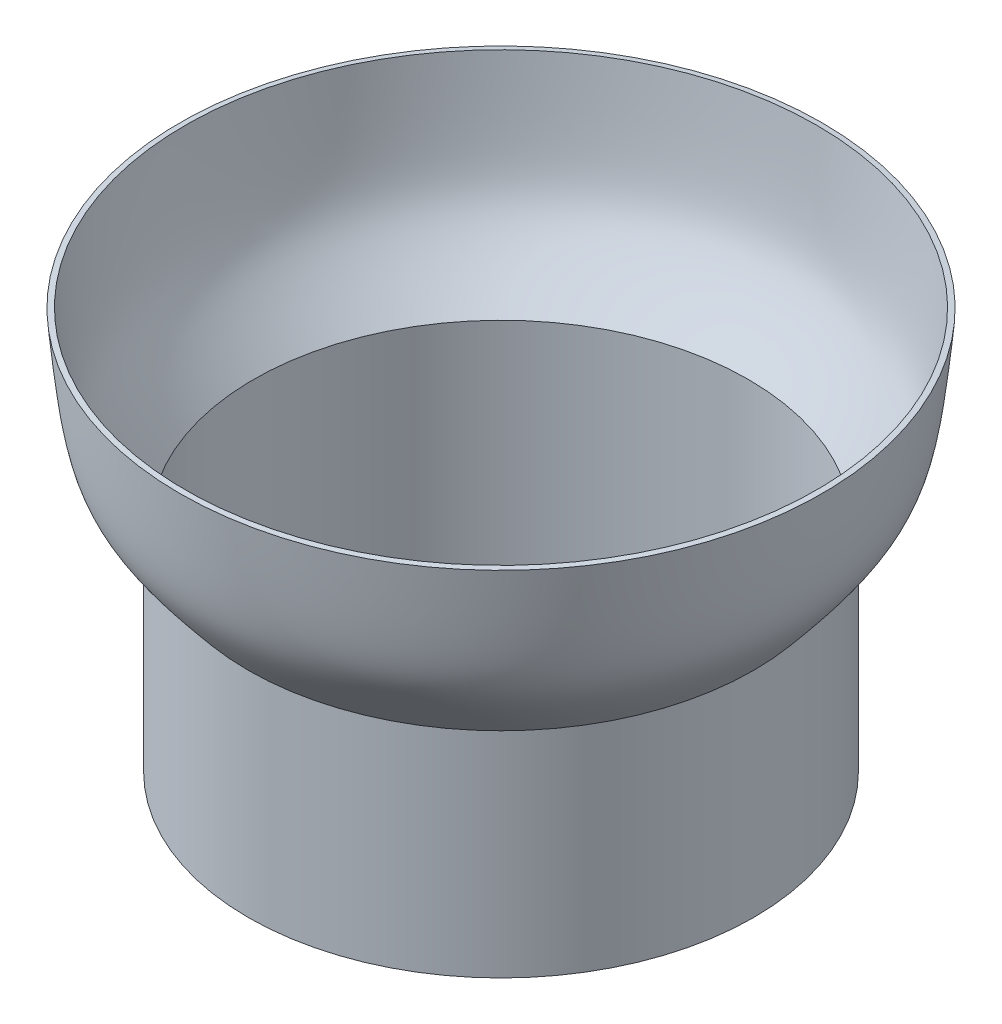
ISO-10303-21;
HEADER;
FILE_DESCRIPTION(('STEP AP214'),'2;1');
FILE_NAME('part.step','',(''),(''),'','','');
FILE_SCHEMA(('AUTOMOTIVE_DESIGN { 1 0 10303 214 1 1 1 1 }'));
ENDSEC;
DATA;
#1=APPLICATION_CONTEXT('core data for automotive mechanical design processes');
#2=APPLICATION_PROTOCOL_DEFINITION('international standard','automotive_design',2000,#1);
#3=PRODUCT_CONTEXT('',#1,'mechanical');
#4=PRODUCT('Part','Part','',(#3));
#5=PRODUCT_RELATED_PRODUCT_CATEGORY('part','',(#4));
#6=PRODUCT_DEFINITION_FORMATION('','',#4);
#7=PRODUCT_DEFINITION_CONTEXT('part definition',#1,'design');
#8=PRODUCT_DEFINITION('design','',#6,#7);
#9=PRODUCT_DEFINITION_SHAPE('','',#8);
#10=(LENGTH_UNIT() NAMED_UNIT(*) SI_UNIT(.MILLI.,.METRE.));
#11=(NAMED_UNIT(*) PLANE_ANGLE_UNIT() SI_UNIT($,.RADIAN.));
#12=(NAMED_UNIT(*) SI_UNIT($,.STERADIAN.) SOLID_ANGLE_UNIT());
#13=UNCERTAINTY_MEASURE_WITH_UNIT(LENGTH_MEASURE(1.E-05),#10,'distance_accuracy_value','');
#14=(GEOMETRIC_REPRESENTATION_CONTEXT(3) GLOBAL_UNCERTAINTY_ASSIGNED_CONTEXT((#13)) GLOBAL_UNIT_ASSIGNED_CONTEXT((#10,
#11,#12)) REPRESENTATION_CONTEXT('',''));
#15=CARTESIAN_POINT('',(0.,0.,0.));
#16=DIRECTION('',(0.,0.,1.));
#17=DIRECTION('',(1.,0.,0.));
#18=AXIS2_PLACEMENT_3D('',#15,#16,#17);
#19=CARTESIAN_POINT('',(-462.221279906965,189.468562930248,0.));
#20=CARTESIAN_POINT('',(-462.638727187563,189.971473829156,0.));
#21=CARTESIAN_POINT('',(-463.05617446816,190.474384728063,0.));
#22=CARTESIAN_POINT('',(-463.891069029356,191.480206525878,0.));
#23=CARTESIAN_POINT('',(-464.310013180815,191.984860190495,0.));
#24=CARTESIAN_POINT('',(-465.555473160915,193.485540781725,0.));
#25=CARTESIAN_POINT('',(-466.370119475128,194.468125899693,0.));
#26=CARTESIAN_POINT('',(-468.769642164434,197.36522916039,0.));
#27=CARTESIAN_POINT('',(-470.310156882599,199.229157995331,0.));
#28=CARTESIAN_POINT('',(-474.772575202789,204.639690207482,0.));
#29=CARTESIAN_POINT('',(-477.536006949211,208.005791304588,0.));
#30=CARTESIAN_POINT('',(-482.719200026698,214.347595737198,0.));
#31=CARTESIAN_POINT('',(-485.138754080886,217.323060644904,0.));
#32=CARTESIAN_POINT('',(-489.694514888405,222.953149085233,0.));
#33=CARTESIAN_POINT('',(-491.83058113971,225.607610991126,0.));
#34=CARTESIAN_POINT('',(-495.866361926946,230.649927487456,0.));
#35=CARTESIAN_POINT('',(-497.765978934161,233.037669874773,0.));
#36=CARTESIAN_POINT('',(-501.366016939115,237.589471260754,0.));
#37=CARTESIAN_POINT('',(-503.06636879952,239.75345070684,0.));
#38=CARTESIAN_POINT('',(-507.91327745161,245.961510998767,0.));
#39=CARTESIAN_POINT('',(-510.807717031913,249.724042885557,0.));
#40=CARTESIAN_POINT('',(-516.098766667554,256.70069087593,0.));
#41=CARTESIAN_POINT('',(-518.494489322654,259.913784613676,0.));
#42=CARTESIAN_POINT('',(-522.906507048487,265.929622686437,0.));
#43=CARTESIAN_POINT('',(-524.92228976276,268.731775422673,0.));
#44=CARTESIAN_POINT('',(-528.658456213987,274.024516139301,0.));
#45=CARTESIAN_POINT('',(-530.378530263682,276.514744928922,0.));
#46=CARTESIAN_POINT('',(-533.584692873426,281.256743756321,0.));
#47=CARTESIAN_POINT('',(-535.07058703392,283.508286459819,0.));
#48=CARTESIAN_POINT('',(-537.854455489406,287.828800021788,0.));
#49=CARTESIAN_POINT('',(-539.152303902086,289.897621628851,0.));
#50=CARTESIAN_POINT('',(-541.595443633358,293.896826616651,0.));
#51=CARTESIAN_POINT('',(-542.740651326348,295.827108713816,0.));
#52=CARTESIAN_POINT('',(-545.989007044548,301.464349927988,0.));
#53=CARTESIAN_POINT('',(-547.906811754877,305.019381946382,0.));
#54=CARTESIAN_POINT('',(-551.40734437966,311.95208818961,0.));
#55=CARTESIAN_POINT('',(-552.989158659594,315.328504679933,0.));
#56=CARTESIAN_POINT('',(-555.923889139396,322.089666518214,0.));
#57=CARTESIAN_POINT('',(-557.276293028941,325.473552946147,0.));
#58=CARTESIAN_POINT('',(-559.827457223168,332.426287174518,0.));
#59=CARTESIAN_POINT('',(-561.025867359714,335.994282712858,0.));
#60=CARTESIAN_POINT('',(-563.325541560026,343.507042325603,0.));
#61=CARTESIAN_POINT('',(-564.42651253069,347.450614568234,0.));
#62=CARTESIAN_POINT('',(-566.578352041585,355.950756725164,0.));
#63=CARTESIAN_POINT('',(-567.628919822821,360.505305488336,0.));
#64=CARTESIAN_POINT('',(-569.201872546032,368.041839065713,0.));
#65=CARTESIAN_POINT('',(-569.725727059501,370.672349694896,0.));
#66=CARTESIAN_POINT('',(-570.779079424335,376.22624672872,0.));
#67=CARTESIAN_POINT('',(-571.308561127856,379.14946335346,0.));
#68=CARTESIAN_POINT('',(-572.380709394276,385.35975775185,0.));
#69=CARTESIAN_POINT('',(-572.923353525981,388.646584495728,0.));
#70=CARTESIAN_POINT('',(-574.030932351874,395.676275870087,0.));
#71=CARTESIAN_POINT('',(-574.595834003062,399.418757546467,0.));
#72=CARTESIAN_POINT('',(-575.759410459359,407.482408616896,0.));
#73=CARTESIAN_POINT('',(-576.358034016956,411.80297312963,0.));
#74=CARTESIAN_POINT('',(-577.604143685471,421.190321249759,0.));
#75=CARTESIAN_POINT('',(-578.251546334693,426.256110848415,0.));
#76=CARTESIAN_POINT('',(-579.274786590827,434.591180124683,0.));
#77=CARTESIAN_POINT('',(-579.624607011754,437.492888606615,0.));
#78=CARTESIAN_POINT('',(-580.345106058838,443.582122752892,0.));
#79=CARTESIAN_POINT('',(-580.715778797863,446.769577927036,0.));
#80=CARTESIAN_POINT('',(-581.482053706239,453.4778096821,0.));
#81=CARTESIAN_POINT('',(-581.877647896104,456.998490646264,0.));
#82=CARTESIAN_POINT('',(-582.698744775903,464.43163447675,0.));
#83=CARTESIAN_POINT('',(-583.124236468324,468.343965494779,0.));
#84=CARTESIAN_POINT('',(-584.011295891725,476.6331898157,0.));
#85=CARTESIAN_POINT('',(-584.472848183416,481.00989795647,0.));
#86=CARTESIAN_POINT('',(-585.439775129269,490.319657134964,0.));
#87=CARTESIAN_POINT('',(-585.945127657675,495.252442762703,0.));
#88=CARTESIAN_POINT('',(-587.009533768398,505.791777624135,0.));
#89=CARTESIAN_POINT('',(-587.568554899853,511.397937538381,0.));
#90=CARTESIAN_POINT('',(-588.753111772319,523.436708896695,0.));
#91=CARTESIAN_POINT('',(-589.378598651138,529.868734079129,0.));
#92=CARTESIAN_POINT('',(-590.045813273708,536.81511603146,0.));
#93=B_SPLINE_CURVE_WITH_KNOTS('',3,(#19,#20,#21,#22,#23,#24,#25,#26,#27,#28,#29,#30,#31,#32,#33,
#34,#35,#36,#37,#38,#39,#40,#41,#42,#43,#44,#45,#46,#47,#48,#49,#50,#51,#52,#53,#54,#55,#56,#57,
#58,#59,#60,#61,#62,#63,#64,#65,#66,#67,#68,#69,#70,#71,#72,#73,#74,#75,#76,#77,#78,#79,#80,#81,
#82,#83,#84,#85,#86,#87,#88,#89,#90,#91,#92),.UNSPECIFIED.,.F.,.F.,(4,2,2,2,2,2,2,2,2,2,2,2,2,2,
2,2,2,2,2,2,2,2,2,2,2,2,2,2,2,2,2,2,2,2,2,2,4),(0.,0.00195312499999998,0.00390624999999995,
0.00781250000000002,0.0156250000000001,0.0312500000000003,0.0468750000000005,0.0625000000000007,
0.0781250000000008,0.093750000000001,0.125000000000001,0.156250000000001,0.187500000000001,
0.218750000000001,0.250000000000001,0.281250000000001,0.3125,0.375,0.4375,0.5,0.5625,0.625,
0.6875,0.71875,0.749999999999999,0.781249999999999,0.812499999999999,0.843749999999999,
0.874999999999999,0.890625,0.90625,0.921875,0.9375,0.953125,0.96875,0.984375,1.),.UNSPECIFIED.);
#94=CARTESIAN_POINT('',(0.,0.,0.));
#95=DIRECTION('',(0.,-1.,0.));
#96=AXIS1_PLACEMENT('',#94,#95);
#97=SURFACE_OF_REVOLUTION('',#93,#96);
#98=CARTESIAN_POINT('',(0.,536.815116031459,0.));
#99=DIRECTION('',(0.,-1.,0.));
#100=DIRECTION('',(0.,0.,-1.));
#101=AXIS2_PLACEMENT_3D('',#98,#99,#100);
#102=CIRCLE('',#101,590.045813273708);
#103=CARTESIAN_POINT('',(0.,536.815116031459,-590.045813273708));
#104=VERTEX_POINT('',#103);
#105=EDGE_CURVE('E54',#104,#104,#102,.T.);
#106=ORIENTED_EDGE('',*,*,#105,.F.);
#107=EDGE_LOOP('',(#106));
#108=FACE_BOUND('',#107,.T.);
#109=CARTESIAN_POINT('',(0.,189.468562930248,0.));
#110=DIRECTION('',(0.,-1.,0.));
#111=DIRECTION('',(0.,0.,-1.));
#112=AXIS2_PLACEMENT_3D('',#109,#110,#111);
#113=CIRCLE('',#112,462.221279906965);
#114=CARTESIAN_POINT('',(0.,189.468562930248,-462.221279906965));
#115=VERTEX_POINT('',#114);
#116=EDGE_CURVE('E10',#115,#115,#113,.T.);
#117=ORIENTED_EDGE('',*,*,#116,.T.);
#118=EDGE_LOOP('',(#117));
#119=FACE_BOUND('',#118,.T.);
#120=ADVANCED_FACE('F31',(#108,#119),#97,.T.);
#121=CARTESIAN_POINT('',(0.,0.,0.));
#122=DIRECTION('',(0.,-1.,0.));
#123=DIRECTION('',(0.,0.,-1.));
#124=AXIS2_PLACEMENT_3D('',#121,#122,#123);
#125=CYLINDRICAL_SURFACE('',#124,462.221279906965);
#126=ORIENTED_EDGE('',*,*,#116,.F.);
#127=EDGE_LOOP('',(#126));
#128=FACE_BOUND('',#127,.T.);
#129=CARTESIAN_POINT('',(0.,-214.141004577104,0.));
#130=DIRECTION('',(0.,-1.,0.));
#131=DIRECTION('',(0.,0.,-1.));
#132=AXIS2_PLACEMENT_3D('',#129,#130,#131);
#133=CIRCLE('',#132,462.221279906965);
#134=CARTESIAN_POINT('',(0.,-214.141004577104,-462.221279906965));
#135=VERTEX_POINT('',#134);
#136=EDGE_CURVE('E38',#135,#135,#133,.T.);
#137=ORIENTED_EDGE('',*,*,#136,.T.);
#138=EDGE_LOOP('',(#137));
#139=FACE_BOUND('',#138,.T.);
#140=ADVANCED_FACE('F79',(#128,#139),#125,.F.);
#141=CARTESIAN_POINT('',(-462.221279906965,-214.141004577104,0.));
#142=DIRECTION('',(0.,-1.,0.));
#143=DIRECTION('',(0.,0.,-1.));
#144=AXIS2_PLACEMENT_3D('',#141,#142,#143);
#145=PLANE('',#144);
#146=CARTESIAN_POINT('',(0.,-214.141004577104,0.));
#147=DIRECTION('',(0.,-1.,0.));
#148=DIRECTION('',(0.,0.,-1.));
#149=AXIS2_PLACEMENT_3D('',#146,#147,#148);
#150=CIRCLE('',#149,472.221279906965);
#151=CARTESIAN_POINT('',(0.,-214.141004577104,-472.221279906965));
#152=VERTEX_POINT('',#151);
#153=EDGE_CURVE('E42',#152,#152,#150,.T.);
#154=ORIENTED_EDGE('',*,*,#153,.T.);
#155=EDGE_LOOP('',(#154));
#156=FACE_BOUND('',#155,.T.);
#157=ORIENTED_EDGE('',*,*,#136,.F.);
#158=EDGE_LOOP('',(#157));
#159=FACE_BOUND('',#158,.T.);
#160=ADVANCED_FACE('F76',(#156,#159),#145,.T.);
#161=CARTESIAN_POINT('',(0.,0.,0.));
#162=DIRECTION('',(0.,-1.,0.));
#163=DIRECTION('',(0.,0.,-1.));
#164=AXIS2_PLACEMENT_3D('',#161,#162,#163);
#165=CYLINDRICAL_SURFACE('',#164,472.221279906965);
#166=CARTESIAN_POINT('',(0.,185.858995422896,0.));
#167=DIRECTION('',(0.,-1.,0.));
#168=DIRECTION('',(0.,0.,-1.));
#169=AXIS2_PLACEMENT_3D('',#166,#167,#168);
#170=CIRCLE('',#169,472.221279906965);
#171=CARTESIAN_POINT('',(0.,185.858995422896,-472.221279906965));
#172=VERTEX_POINT('',#171);
#173=EDGE_CURVE('E46',#172,#172,#170,.T.);
#174=ORIENTED_EDGE('',*,*,#173,.T.);
#175=EDGE_LOOP('',(#174));
#176=FACE_BOUND('',#175,.T.);
#177=ORIENTED_EDGE('',*,*,#153,.F.);
#178=EDGE_LOOP('',(#177));
#179=FACE_BOUND('',#178,.T.);
#180=ADVANCED_FACE('F72',(#176,#179),#165,.T.);
#181=CARTESIAN_POINT('',(-472.221279906965,185.858995422896,0.));
#182=CARTESIAN_POINT('',(-578.703546651161,314.141283929732,0.));
#183=CARTESIAN_POINT('',(-600.,535.858995422896,0.));
#184=(BOUNDED_CURVE() B_SPLINE_CURVE(2,(#181,#182,#183),.UNSPECIFIED.,.F.,
.F.) B_SPLINE_CURVE_WITH_KNOTS((3,3),(0.,1.),
.UNSPECIFIED.) CURVE() GEOMETRIC_REPRESENTATION_ITEM() RATIONAL_B_SPLINE_CURVE((1.,3.,1.)) REPRESENTATION_ITEM(''));
#185=CARTESIAN_POINT('',(0.,0.,0.));
#186=DIRECTION('',(0.,-1.,0.));
#187=AXIS1_PLACEMENT('',#185,#186);
#188=SURFACE_OF_REVOLUTION('',#184,#187);
#189=CARTESIAN_POINT('',(0.,535.858995422896,0.));
#190=DIRECTION('',(0.,-1.,0.));
#191=DIRECTION('',(0.,0.,-1.));
#192=AXIS2_PLACEMENT_3D('',#189,#190,#191);
#193=CIRCLE('',#192,600.);
#194=CARTESIAN_POINT('',(0.,535.858995422896,-600.));
#195=VERTEX_POINT('',#194);
#196=EDGE_CURVE('E51',#195,#195,#193,.T.);
#197=ORIENTED_EDGE('',*,*,#196,.T.);
#198=EDGE_LOOP('',(#197));
#199=FACE_BOUND('',#198,.T.);
#200=ORIENTED_EDGE('',*,*,#173,.F.);
#201=EDGE_LOOP('',(#200));
#202=FACE_BOUND('',#201,.T.);
#203=ADVANCED_FACE('F67',(#199,#202),#188,.F.);
#204=CARTESIAN_POINT('',(0.,535.858995422896,0.));
#205=DIRECTION('',(0.,-1.,0.));
#206=DIRECTION('',(0.,0.,-1.));
#207=AXIS2_PLACEMENT_3D('',#204,#205,#206);
#208=CONICAL_SURFACE('',#207,600.,1.47503798779375);
#209=ORIENTED_EDGE('',*,*,#105,.T.);
#210=EDGE_LOOP('',(#209));
#211=FACE_BOUND('',#210,.T.);
#212=ORIENTED_EDGE('',*,*,#196,.F.);
#213=EDGE_LOOP('',(#212));
#214=FACE_BOUND('',#213,.T.);
#215=ADVANCED_FACE('F71',(#211,#214),#208,.T.);
#216=CLOSED_SHELL('',(#120,#140,#160,#180,#203,#215));
#217=MANIFOLD_SOLID_BREP('B2',#216);
#218=ADVANCED_BREP_SHAPE_REPRESENTATION('',(#18,#217),#14);
#219=SHAPE_DEFINITION_REPRESENTATION(#9,#218);
ENDSEC;
END-ISO-10303-21;
